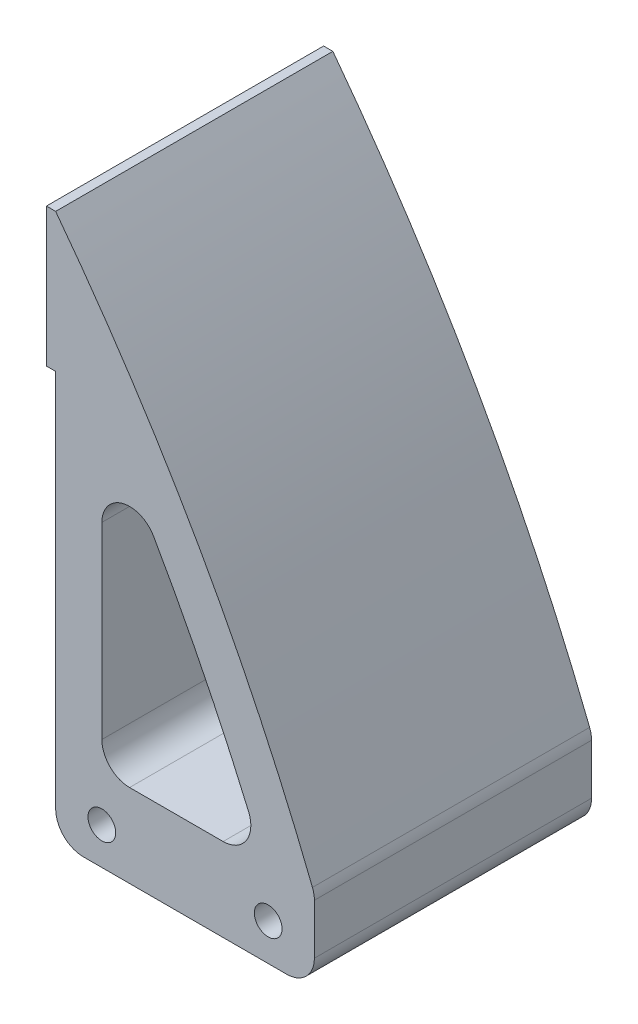
ISO-10303-21;
HEADER;
FILE_DESCRIPTION(('STEP AP214'),'2;1');
FILE_NAME('part.step','',(''),(''),'','','');
FILE_SCHEMA(('AUTOMOTIVE_DESIGN { 1 0 10303 214 1 1 1 1 }'));
ENDSEC;
DATA;
#1=APPLICATION_CONTEXT('core data for automotive mechanical design processes');
#2=APPLICATION_PROTOCOL_DEFINITION('international standard','automotive_design',2000,#1);
#3=PRODUCT_CONTEXT('',#1,'mechanical');
#4=PRODUCT('Part','Part','',(#3));
#5=PRODUCT_RELATED_PRODUCT_CATEGORY('part','',(#4));
#6=PRODUCT_DEFINITION_FORMATION('','',#4);
#7=PRODUCT_DEFINITION_CONTEXT('part definition',#1,'design');
#8=PRODUCT_DEFINITION('design','',#6,#7);
#9=PRODUCT_DEFINITION_SHAPE('','',#8);
#10=(LENGTH_UNIT() NAMED_UNIT(*) SI_UNIT(.MILLI.,.METRE.));
#11=(NAMED_UNIT(*) PLANE_ANGLE_UNIT() SI_UNIT($,.RADIAN.));
#12=(NAMED_UNIT(*) SI_UNIT($,.STERADIAN.) SOLID_ANGLE_UNIT());
#13=UNCERTAINTY_MEASURE_WITH_UNIT(LENGTH_MEASURE(1.E-05),#10,'distance_accuracy_value','');
#14=(GEOMETRIC_REPRESENTATION_CONTEXT(3) GLOBAL_UNCERTAINTY_ASSIGNED_CONTEXT((#13)) GLOBAL_UNIT_ASSIGNED_CONTEXT((#10,
#11,#12)) REPRESENTATION_CONTEXT('',''));
#15=CARTESIAN_POINT('',(0.,0.,0.));
#16=DIRECTION('',(0.,0.,1.));
#17=DIRECTION('',(1.,0.,0.));
#18=AXIS2_PLACEMENT_3D('',#15,#16,#17);
#19=CARTESIAN_POINT('',(0.,0.,30.));
#20=DIRECTION('',(0.,0.,1.));
#21=DIRECTION('',(1.,0.,0.));
#22=AXIS2_PLACEMENT_3D('',#19,#20,#21);
#23=PLANE('',#22);
#24=DIRECTION('',(1.,0.,0.));
#25=VECTOR('',#24,1.);
#26=CARTESIAN_POINT('',(0.,6.,30.));
#27=LINE('',#26,#25);
#28=CARTESIAN_POINT('',(-6.,6.,30.));
#29=VERTEX_POINT('',#28);
#30=CARTESIAN_POINT('',(4.12224643848649,6.,30.));
#31=VERTEX_POINT('',#30);
#32=EDGE_CURVE('E209',#29,#31,#27,.T.);
#33=ORIENTED_EDGE('',*,*,#32,.F.);
#34=CARTESIAN_POINT('',(-6.,9.,30.));
#35=DIRECTION('',(0.,0.,1.));
#36=DIRECTION('',(1.,0.,0.));
#37=AXIS2_PLACEMENT_3D('',#34,#35,#36);
#38=CIRCLE('',#37,3.);
#39=CARTESIAN_POINT('',(-9.,9.,30.));
#40=VERTEX_POINT('',#39);
#41=EDGE_CURVE('E305',#29,#40,#38,.F.);
#42=ORIENTED_EDGE('',*,*,#41,.T.);
#43=DIRECTION('',(0.,1.,0.));
#44=VECTOR('',#43,1.);
#45=CARTESIAN_POINT('',(-9.,0.,30.));
#46=LINE('',#45,#44);
#47=CARTESIAN_POINT('',(-9.00000000000001,29.3493274595195,30.));
#48=VERTEX_POINT('',#47);
#49=EDGE_CURVE('E201',#40,#48,#46,.T.);
#50=ORIENTED_EDGE('',*,*,#49,.T.);
#51=CARTESIAN_POINT('',(-6.,29.3493274595195,30.));
#52=DIRECTION('',(0.,0.,1.));
#53=DIRECTION('',(1.,0.,0.));
#54=AXIS2_PLACEMENT_3D('',#51,#52,#53);
#55=CIRCLE('',#54,3.);
#56=CARTESIAN_POINT('',(-3.39337560676392,30.8344231711107,30.));
#57=VERTEX_POINT('',#56);
#58=EDGE_CURVE('E299',#48,#57,#55,.F.);
#59=ORIENTED_EDGE('',*,*,#58,.T.);
#60=CARTESIAN_POINT('',(-181.512709144563,-70.6471171209553,30.));
#61=DIRECTION('',(0.,0.,1.));
#62=DIRECTION('',(1.,0.,0.));
#63=AXIS2_PLACEMENT_3D('',#60,#61,#62);
#64=CIRCLE('',#63,205.);
#65=CARTESIAN_POINT('',(6.87920122437335,10.1828779770439,30.));
#66=VERTEX_POINT('',#65);
#67=EDGE_CURVE('E205',#57,#66,#64,.F.);
#68=ORIENTED_EDGE('',*,*,#67,.T.);
#69=CARTESIAN_POINT('',(4.12224643848649,9.00000000000001,30.));
#70=DIRECTION('',(0.,0.,1.));
#71=DIRECTION('',(1.,0.,0.));
#72=AXIS2_PLACEMENT_3D('',#69,#70,#71);
#73=CIRCLE('',#72,3.);
#74=EDGE_CURVE('E293',#66,#31,#73,.F.);
#75=ORIENTED_EDGE('',*,*,#74,.T.);
#76=EDGE_LOOP('',(#33,#42,#50,#59,#68,#75));
#77=FACE_BOUND('',#76,.T.);
#78=CARTESIAN_POINT('',(-9.00000000000001,1.,30.));
#79=DIRECTION('',(0.,0.,1.));
#80=DIRECTION('',(1.,0.,0.));
#81=AXIS2_PLACEMENT_3D('',#78,#79,#80);
#82=CIRCLE('',#81,1.5);
#83=CARTESIAN_POINT('',(-7.50000000000001,1.,30.));
#84=VERTEX_POINT('',#83);
#85=EDGE_CURVE('E213',#84,#84,#82,.T.);
#86=ORIENTED_EDGE('',*,*,#85,.F.);
#87=EDGE_LOOP('',(#86));
#88=FACE_BOUND('',#87,.T.);
#89=CARTESIAN_POINT('',(8.99999999999999,1.,30.));
#90=DIRECTION('',(0.,0.,1.));
#91=DIRECTION('',(1.,0.,0.));
#92=AXIS2_PLACEMENT_3D('',#89,#90,#91);
#93=CIRCLE('',#92,1.5);
#94=CARTESIAN_POINT('',(10.5,1.,30.));
#95=VERTEX_POINT('',#94);
#96=EDGE_CURVE('E217',#95,#95,#93,.F.);
#97=ORIENTED_EDGE('',*,*,#96,.T.);
#98=EDGE_LOOP('',(#97));
#99=FACE_BOUND('',#98,.T.);
#100=DIRECTION('',(1.,0.,0.));
#101=VECTOR('',#100,1.);
#102=CARTESIAN_POINT('',(0.,-3.,30.));
#103=LINE('',#102,#101);
#104=CARTESIAN_POINT('',(-11.,-3.,30.));
#105=VERTEX_POINT('',#104);
#106=CARTESIAN_POINT('',(11.,-3.,30.));
#107=VERTEX_POINT('',#106);
#108=EDGE_CURVE('E360',#105,#107,#103,.T.);
#109=ORIENTED_EDGE('',*,*,#108,.T.);
#110=CARTESIAN_POINT('',(11.,0.,30.));
#111=DIRECTION('',(0.,0.,1.));
#112=DIRECTION('',(1.,0.,0.));
#113=AXIS2_PLACEMENT_3D('',#110,#111,#112);
#114=CIRCLE('',#113,3.);
#115=CARTESIAN_POINT('',(14.,0.,30.));
#116=VERTEX_POINT('',#115);
#117=EDGE_CURVE('E334',#107,#116,#114,.T.);
#118=ORIENTED_EDGE('',*,*,#117,.T.);
#119=DIRECTION('',(0.,-1.,0.));
#120=VECTOR('',#119,1.);
#121=CARTESIAN_POINT('',(14.,0.,30.));
#122=LINE('',#121,#120);
#123=CARTESIAN_POINT('',(14.,5.43084826864239,30.));
#124=VERTEX_POINT('',#123);
#125=EDGE_CURVE('E184',#124,#116,#122,.T.);
#126=ORIENTED_EDGE('',*,*,#125,.F.);
#127=CARTESIAN_POINT('',(11.,5.43084826864239,30.));
#128=DIRECTION('',(0.,0.,1.));
#129=DIRECTION('',(1.,0.,0.));
#130=AXIS2_PLACEMENT_3D('',#127,#128,#129);
#131=CIRCLE('',#130,3.);
#132=CARTESIAN_POINT('',(13.7900392629647,6.53342747718728,30.));
#133=VERTEX_POINT('',#132);
#134=EDGE_CURVE('E61',#124,#133,#131,.T.);
#135=ORIENTED_EDGE('',*,*,#134,.T.);
#136=CARTESIAN_POINT('',(-181.512709144563,-70.6471171209553,30.));
#137=DIRECTION('',(0.,0.,1.));
#138=DIRECTION('',(1.,0.,0.));
#139=AXIS2_PLACEMENT_3D('',#136,#137,#138);
#140=CIRCLE('',#139,210.);
#141=CARTESIAN_POINT('',(-14.,56.,30.));
#142=VERTEX_POINT('',#141);
#143=EDGE_CURVE('E164',#142,#133,#140,.F.);
#144=ORIENTED_EDGE('',*,*,#143,.F.);
#145=DIRECTION('',(-1.,0.,0.));
#146=VECTOR('',#145,1.);
#147=CARTESIAN_POINT('',(0.,56.,30.));
#148=LINE('',#147,#146);
#149=CARTESIAN_POINT('',(-15.,56.,30.));
#150=VERTEX_POINT('',#149);
#151=EDGE_CURVE('E175',#142,#150,#148,.T.);
#152=ORIENTED_EDGE('',*,*,#151,.T.);
#153=DIRECTION('',(0.,-1.,0.));
#154=VECTOR('',#153,1.);
#155=CARTESIAN_POINT('',(-15.,0.,30.));
#156=LINE('',#155,#154);
#157=CARTESIAN_POINT('',(-15.,41.,30.));
#158=VERTEX_POINT('',#157);
#159=EDGE_CURVE('E180',#150,#158,#156,.T.);
#160=ORIENTED_EDGE('',*,*,#159,.T.);
#161=DIRECTION('',(-1.,0.,0.));
#162=VECTOR('',#161,1.);
#163=CARTESIAN_POINT('',(0.,41.,30.));
#164=LINE('',#163,#162);
#165=CARTESIAN_POINT('',(-14.,41.,30.));
#166=VERTEX_POINT('',#165);
#167=EDGE_CURVE('E194',#166,#158,#164,.T.);
#168=ORIENTED_EDGE('',*,*,#167,.F.);
#169=DIRECTION('',(0.,1.,0.));
#170=VECTOR('',#169,1.);
#171=CARTESIAN_POINT('',(-14.,0.,30.));
#172=LINE('',#171,#170);
#173=CARTESIAN_POINT('',(-14.,0.,30.));
#174=VERTEX_POINT('',#173);
#175=EDGE_CURVE('E198',#174,#166,#172,.T.);
#176=ORIENTED_EDGE('',*,*,#175,.F.);
#177=CARTESIAN_POINT('',(-11.,0.,30.));
#178=DIRECTION('',(0.,0.,1.));
#179=DIRECTION('',(1.,0.,0.));
#180=AXIS2_PLACEMENT_3D('',#177,#178,#179);
#181=CIRCLE('',#180,3.);
#182=EDGE_CURVE('E69',#174,#105,#181,.T.);
#183=ORIENTED_EDGE('',*,*,#182,.T.);
#184=EDGE_LOOP('',(#109,#118,#126,#135,#144,#152,#160,#168,#176,#183));
#185=FACE_BOUND('',#184,.T.);
#186=ADVANCED_FACE('F45',(#77,#88,#99,#185),#23,.T.);
#187=CARTESIAN_POINT('',(0.,0.,0.));
#188=DIRECTION('',(0.,0.,1.));
#189=DIRECTION('',(1.,0.,0.));
#190=AXIS2_PLACEMENT_3D('',#187,#188,#189);
#191=PLANE('',#190);
#192=CARTESIAN_POINT('',(8.99999999999999,1.,0.));
#193=DIRECTION('',(0.,0.,1.));
#194=DIRECTION('',(1.,0.,0.));
#195=AXIS2_PLACEMENT_3D('',#192,#193,#194);
#196=CIRCLE('',#195,1.5);
#197=CARTESIAN_POINT('',(10.5,1.,0.));
#198=VERTEX_POINT('',#197);
#199=EDGE_CURVE('E188',#198,#198,#196,.F.);
#200=ORIENTED_EDGE('',*,*,#199,.F.);
#201=EDGE_LOOP('',(#200));
#202=FACE_BOUND('',#201,.T.);
#203=CARTESIAN_POINT('',(-9.00000000000001,1.,0.));
#204=DIRECTION('',(0.,0.,1.));
#205=DIRECTION('',(1.,0.,0.));
#206=AXIS2_PLACEMENT_3D('',#203,#204,#205);
#207=CIRCLE('',#206,1.5);
#208=CARTESIAN_POINT('',(-7.50000000000001,1.,0.));
#209=VERTEX_POINT('',#208);
#210=EDGE_CURVE('E255',#209,#209,#207,.T.);
#211=ORIENTED_EDGE('',*,*,#210,.T.);
#212=EDGE_LOOP('',(#211));
#213=FACE_BOUND('',#212,.T.);
#214=DIRECTION('',(0.,1.,0.));
#215=VECTOR('',#214,1.);
#216=CARTESIAN_POINT('',(-9.,0.,0.));
#217=LINE('',#216,#215);
#218=CARTESIAN_POINT('',(-9.,9.,0.));
#219=VERTEX_POINT('',#218);
#220=CARTESIAN_POINT('',(-9.00000000000001,29.3493274595195,0.));
#221=VERTEX_POINT('',#220);
#222=EDGE_CURVE('E243',#219,#221,#217,.T.);
#223=ORIENTED_EDGE('',*,*,#222,.F.);
#224=CARTESIAN_POINT('',(-6.,9.,0.));
#225=DIRECTION('',(0.,0.,1.));
#226=DIRECTION('',(1.,0.,0.));
#227=AXIS2_PLACEMENT_3D('',#224,#225,#226);
#228=CIRCLE('',#227,3.);
#229=CARTESIAN_POINT('',(-6.,6.,0.));
#230=VERTEX_POINT('',#229);
#231=EDGE_CURVE('E302',#219,#230,#228,.T.);
#232=ORIENTED_EDGE('',*,*,#231,.T.);
#233=DIRECTION('',(1.,0.,0.));
#234=VECTOR('',#233,1.);
#235=CARTESIAN_POINT('',(0.,6.,0.));
#236=LINE('',#235,#234);
#237=CARTESIAN_POINT('',(4.12224643848649,6.,0.));
#238=VERTEX_POINT('',#237);
#239=EDGE_CURVE('E251',#230,#238,#236,.T.);
#240=ORIENTED_EDGE('',*,*,#239,.T.);
#241=CARTESIAN_POINT('',(4.12224643848649,9.00000000000001,0.));
#242=DIRECTION('',(0.,0.,1.));
#243=DIRECTION('',(1.,0.,0.));
#244=AXIS2_PLACEMENT_3D('',#241,#242,#243);
#245=CIRCLE('',#244,3.);
#246=CARTESIAN_POINT('',(6.87920122437335,10.1828779770439,0.));
#247=VERTEX_POINT('',#246);
#248=EDGE_CURVE('E290',#238,#247,#245,.T.);
#249=ORIENTED_EDGE('',*,*,#248,.T.);
#250=CARTESIAN_POINT('',(-181.512709144563,-70.6471171209553,0.));
#251=DIRECTION('',(0.,0.,1.));
#252=DIRECTION('',(1.,0.,0.));
#253=AXIS2_PLACEMENT_3D('',#250,#251,#252);
#254=CIRCLE('',#253,205.);
#255=CARTESIAN_POINT('',(-3.39337560676392,30.8344231711107,0.));
#256=VERTEX_POINT('',#255);
#257=EDGE_CURVE('E247',#256,#247,#254,.F.);
#258=ORIENTED_EDGE('',*,*,#257,.F.);
#259=CARTESIAN_POINT('',(-6.,29.3493274595195,0.));
#260=DIRECTION('',(0.,0.,1.));
#261=DIRECTION('',(1.,0.,0.));
#262=AXIS2_PLACEMENT_3D('',#259,#260,#261);
#263=CIRCLE('',#262,3.);
#264=EDGE_CURVE('E296',#256,#221,#263,.T.);
#265=ORIENTED_EDGE('',*,*,#264,.T.);
#266=EDGE_LOOP('',(#223,#232,#240,#249,#258,#265));
#267=FACE_BOUND('',#266,.T.);
#268=DIRECTION('',(0.,-1.,0.));
#269=VECTOR('',#268,1.);
#270=CARTESIAN_POINT('',(14.,0.,0.));
#271=LINE('',#270,#269);
#272=CARTESIAN_POINT('',(14.,5.43084826864239,0.));
#273=VERTEX_POINT('',#272);
#274=CARTESIAN_POINT('',(14.,0.,0.));
#275=VERTEX_POINT('',#274);
#276=EDGE_CURVE('E222',#273,#275,#271,.T.);
#277=ORIENTED_EDGE('',*,*,#276,.T.);
#278=CARTESIAN_POINT('',(11.,0.,0.));
#279=DIRECTION('',(0.,0.,1.));
#280=DIRECTION('',(1.,0.,0.));
#281=AXIS2_PLACEMENT_3D('',#278,#279,#280);
#282=CIRCLE('',#281,3.);
#283=CARTESIAN_POINT('',(11.,-3.,0.));
#284=VERTEX_POINT('',#283);
#285=EDGE_CURVE('E321',#275,#284,#282,.F.);
#286=ORIENTED_EDGE('',*,*,#285,.T.);
#287=DIRECTION('',(1.,0.,0.));
#288=VECTOR('',#287,1.);
#289=CARTESIAN_POINT('',(0.,-3.,0.));
#290=LINE('',#289,#288);
#291=CARTESIAN_POINT('',(-11.,-3.,0.));
#292=VERTEX_POINT('',#291);
#293=EDGE_CURVE('E226',#292,#284,#290,.T.);
#294=ORIENTED_EDGE('',*,*,#293,.F.);
#295=CARTESIAN_POINT('',(-11.,0.,0.));
#296=DIRECTION('',(0.,0.,1.));
#297=DIRECTION('',(1.,0.,0.));
#298=AXIS2_PLACEMENT_3D('',#295,#296,#297);
#299=CIRCLE('',#298,3.);
#300=CARTESIAN_POINT('',(-14.,0.,0.));
#301=VERTEX_POINT('',#300);
#302=EDGE_CURVE('E315',#292,#301,#299,.F.);
#303=ORIENTED_EDGE('',*,*,#302,.T.);
#304=DIRECTION('',(0.,1.,0.));
#305=VECTOR('',#304,1.);
#306=CARTESIAN_POINT('',(-14.,0.,0.));
#307=LINE('',#306,#305);
#308=CARTESIAN_POINT('',(-14.,41.,0.));
#309=VERTEX_POINT('',#308);
#310=EDGE_CURVE('E240',#301,#309,#307,.T.);
#311=ORIENTED_EDGE('',*,*,#310,.T.);
#312=DIRECTION('',(-1.,0.,0.));
#313=VECTOR('',#312,1.);
#314=CARTESIAN_POINT('',(0.,41.,0.));
#315=LINE('',#314,#313);
#316=CARTESIAN_POINT('',(-15.,41.,0.));
#317=VERTEX_POINT('',#316);
#318=EDGE_CURVE('E236',#309,#317,#315,.T.);
#319=ORIENTED_EDGE('',*,*,#318,.T.);
#320=DIRECTION('',(0.,-1.,0.));
#321=VECTOR('',#320,1.);
#322=CARTESIAN_POINT('',(-15.,0.,0.));
#323=LINE('',#322,#321);
#324=CARTESIAN_POINT('',(-15.,56.,0.));
#325=VERTEX_POINT('',#324);
#326=EDGE_CURVE('E232',#325,#317,#323,.T.);
#327=ORIENTED_EDGE('',*,*,#326,.F.);
#328=DIRECTION('',(-1.,0.,0.));
#329=VECTOR('',#328,1.);
#330=CARTESIAN_POINT('',(0.,56.,0.));
#331=LINE('',#330,#329);
#332=CARTESIAN_POINT('',(-14.,56.,0.));
#333=VERTEX_POINT('',#332);
#334=EDGE_CURVE('E229',#333,#325,#331,.T.);
#335=ORIENTED_EDGE('',*,*,#334,.F.);
#336=CARTESIAN_POINT('',(-181.512709144563,-70.6471171209553,0.));
#337=DIRECTION('',(0.,0.,1.));
#338=DIRECTION('',(1.,0.,0.));
#339=AXIS2_PLACEMENT_3D('',#336,#337,#338);
#340=CIRCLE('',#339,210.);
#341=CARTESIAN_POINT('',(13.7900392629647,6.53342747718728,0.));
#342=VERTEX_POINT('',#341);
#343=EDGE_CURVE('E167',#333,#342,#340,.F.);
#344=ORIENTED_EDGE('',*,*,#343,.T.);
#345=CARTESIAN_POINT('',(11.,5.43084826864239,0.));
#346=DIRECTION('',(0.,0.,1.));
#347=DIRECTION('',(1.,0.,0.));
#348=AXIS2_PLACEMENT_3D('',#345,#346,#347);
#349=CIRCLE('',#348,3.);
#350=EDGE_CURVE('E318',#342,#273,#349,.F.);
#351=ORIENTED_EDGE('',*,*,#350,.T.);
#352=EDGE_LOOP('',(#277,#286,#294,#303,#311,#319,#327,#335,#344,#351));
#353=FACE_BOUND('',#352,.T.);
#354=ADVANCED_FACE('F339',(#202,#213,#267,#353),#191,.F.);
#355=CARTESIAN_POINT('',(-9.,0.,30.));
#356=DIRECTION('',(-1.,0.,0.));
#357=DIRECTION('',(0.,-1.,0.));
#358=AXIS2_PLACEMENT_3D('',#355,#356,#357);
#359=PLANE('',#358);
#360=ORIENTED_EDGE('',*,*,#222,.T.);
#361=DIRECTION('',(0.,0.,1.));
#362=VECTOR('',#361,1.);
#363=CARTESIAN_POINT('',(-9.00000000000001,29.3493274595195,30.));
#364=LINE('',#363,#362);
#365=EDGE_CURVE('E287',#221,#48,#364,.T.);
#366=ORIENTED_EDGE('',*,*,#365,.T.);
#367=ORIENTED_EDGE('',*,*,#49,.F.);
#368=DIRECTION('',(0.,0.,-1.));
#369=VECTOR('',#368,1.);
#370=CARTESIAN_POINT('',(-9.,9.,30.));
#371=LINE('',#370,#369);
#372=EDGE_CURVE('E283',#40,#219,#371,.T.);
#373=ORIENTED_EDGE('',*,*,#372,.T.);
#374=EDGE_LOOP('',(#360,#366,#367,#373));
#375=FACE_BOUND('',#374,.T.);
#376=ADVANCED_FACE('F385',(#375),#359,.F.);
#377=CARTESIAN_POINT('',(-181.512709144563,-70.6471171209553,30.));
#378=DIRECTION('',(0.,0.,-1.));
#379=DIRECTION('',(-1.,0.,0.));
#380=AXIS2_PLACEMENT_3D('',#377,#378,#379);
#381=CYLINDRICAL_SURFACE('',#380,205.);
#382=ORIENTED_EDGE('',*,*,#257,.T.);
#383=DIRECTION('',(0.,0.,-1.));
#384=VECTOR('',#383,1.);
#385=CARTESIAN_POINT('',(6.87920122437338,10.1828779770439,30.));
#386=LINE('',#385,#384);
#387=EDGE_CURVE('E280',#247,#66,#386,.F.);
#388=ORIENTED_EDGE('',*,*,#387,.T.);
#389=ORIENTED_EDGE('',*,*,#67,.F.);
#390=DIRECTION('',(0.,0.,-1.));
#391=VECTOR('',#390,1.);
#392=CARTESIAN_POINT('',(-3.39337560676387,30.8344231711107,30.));
#393=LINE('',#392,#391);
#394=EDGE_CURVE('E276',#57,#256,#393,.T.);
#395=ORIENTED_EDGE('',*,*,#394,.T.);
#396=EDGE_LOOP('',(#382,#388,#389,#395));
#397=FACE_BOUND('',#396,.T.);
#398=ADVANCED_FACE('F405',(#397),#381,.F.);
#399=CARTESIAN_POINT('',(14.,0.,30.));
#400=DIRECTION('',(1.,0.,0.));
#401=DIRECTION('',(0.,0.,-1.));
#402=AXIS2_PLACEMENT_3D('',#399,#400,#401);
#403=PLANE('',#402);
#404=ORIENTED_EDGE('',*,*,#125,.T.);
#405=DIRECTION('',(0.,0.,-1.));
#406=VECTOR('',#405,1.);
#407=CARTESIAN_POINT('',(14.,0.,30.));
#408=LINE('',#407,#406);
#409=EDGE_CURVE('E311',#116,#275,#408,.T.);
#410=ORIENTED_EDGE('',*,*,#409,.T.);
#411=ORIENTED_EDGE('',*,*,#276,.F.);
#412=DIRECTION('',(0.,0.,-1.));
#413=VECTOR('',#412,1.);
#414=CARTESIAN_POINT('',(14.,5.43084826864239,30.));
#415=LINE('',#414,#413);
#416=EDGE_CURVE('E308',#273,#124,#415,.F.);
#417=ORIENTED_EDGE('',*,*,#416,.T.);
#418=EDGE_LOOP('',(#404,#410,#411,#417));
#419=FACE_BOUND('',#418,.T.);
#420=ADVANCED_FACE('F369',(#419),#403,.T.);
#421=CARTESIAN_POINT('',(-181.512709144563,-70.6471171209553,30.));
#422=DIRECTION('',(0.,0.,-1.));
#423=DIRECTION('',(-1.,0.,0.));
#424=AXIS2_PLACEMENT_3D('',#421,#422,#423);
#425=CYLINDRICAL_SURFACE('',#424,210.);
#426=ORIENTED_EDGE('',*,*,#143,.T.);
#427=DIRECTION('',(0.,0.,-1.));
#428=VECTOR('',#427,1.);
#429=CARTESIAN_POINT('',(13.7900392629647,6.53342747718728,30.));
#430=LINE('',#429,#428);
#431=EDGE_CURVE('E54',#133,#342,#430,.T.);
#432=ORIENTED_EDGE('',*,*,#431,.T.);
#433=ORIENTED_EDGE('',*,*,#343,.F.);
#434=DIRECTION('',(0.,0.,-1.));
#435=VECTOR('',#434,1.);
#436=CARTESIAN_POINT('',(-14.,56.,30.));
#437=LINE('',#436,#435);
#438=EDGE_CURVE('E160',#142,#333,#437,.T.);
#439=ORIENTED_EDGE('',*,*,#438,.F.);
#440=EDGE_LOOP('',(#426,#432,#433,#439));
#441=FACE_BOUND('',#440,.T.);
#442=ADVANCED_FACE('F162',(#441),#425,.T.);
#443=CARTESIAN_POINT('',(0.,56.,30.));
#444=DIRECTION('',(0.,-1.,0.));
#445=DIRECTION('',(0.,0.,-1.));
#446=AXIS2_PLACEMENT_3D('',#443,#444,#445);
#447=PLANE('',#446);
#448=ORIENTED_EDGE('',*,*,#334,.T.);
#449=DIRECTION('',(0.,0.,-1.));
#450=VECTOR('',#449,1.);
#451=CARTESIAN_POINT('',(-15.,56.,30.));
#452=LINE('',#451,#450);
#453=EDGE_CURVE('E172',#150,#325,#452,.T.);
#454=ORIENTED_EDGE('',*,*,#453,.F.);
#455=ORIENTED_EDGE('',*,*,#151,.F.);
#456=ORIENTED_EDGE('',*,*,#438,.T.);
#457=EDGE_LOOP('',(#448,#454,#455,#456));
#458=FACE_BOUND('',#457,.T.);
#459=ADVANCED_FACE('F176',(#458),#447,.F.);
#460=CARTESIAN_POINT('',(-15.,0.,30.));
#461=DIRECTION('',(1.,0.,0.));
#462=DIRECTION('',(0.,0.,-1.));
#463=AXIS2_PLACEMENT_3D('',#460,#461,#462);
#464=PLANE('',#463);
#465=ORIENTED_EDGE('',*,*,#326,.T.);
#466=DIRECTION('',(0.,0.,-1.));
#467=VECTOR('',#466,1.);
#468=CARTESIAN_POINT('',(-15.,41.,30.));
#469=LINE('',#468,#467);
#470=EDGE_CURVE('E265',#158,#317,#469,.T.);
#471=ORIENTED_EDGE('',*,*,#470,.F.);
#472=ORIENTED_EDGE('',*,*,#159,.F.);
#473=ORIENTED_EDGE('',*,*,#453,.T.);
#474=EDGE_LOOP('',(#465,#471,#472,#473));
#475=FACE_BOUND('',#474,.T.);
#476=ADVANCED_FACE('F343',(#475),#464,.F.);
#477=CARTESIAN_POINT('',(0.,41.,30.));
#478=DIRECTION('',(0.,-1.,0.));
#479=DIRECTION('',(0.,0.,-1.));
#480=AXIS2_PLACEMENT_3D('',#477,#478,#479);
#481=PLANE('',#480);
#482=ORIENTED_EDGE('',*,*,#318,.F.);
#483=DIRECTION('',(0.,0.,-1.));
#484=VECTOR('',#483,1.);
#485=CARTESIAN_POINT('',(-14.,41.,30.));
#486=LINE('',#485,#484);
#487=EDGE_CURVE('E221',#166,#309,#486,.T.);
#488=ORIENTED_EDGE('',*,*,#487,.F.);
#489=ORIENTED_EDGE('',*,*,#167,.T.);
#490=ORIENTED_EDGE('',*,*,#470,.T.);
#491=EDGE_LOOP('',(#482,#488,#489,#490));
#492=FACE_BOUND('',#491,.T.);
#493=ADVANCED_FACE('F350',(#492),#481,.T.);
#494=CARTESIAN_POINT('',(-14.,0.,30.));
#495=DIRECTION('',(-1.,0.,0.));
#496=DIRECTION('',(0.,-1.,0.));
#497=AXIS2_PLACEMENT_3D('',#494,#495,#496);
#498=PLANE('',#497);
#499=ORIENTED_EDGE('',*,*,#310,.F.);
#500=DIRECTION('',(0.,0.,1.));
#501=VECTOR('',#500,1.);
#502=CARTESIAN_POINT('',(-14.,0.,30.));
#503=LINE('',#502,#501);
#504=EDGE_CURVE('E11',#301,#174,#503,.T.);
#505=ORIENTED_EDGE('',*,*,#504,.T.);
#506=ORIENTED_EDGE('',*,*,#175,.T.);
#507=ORIENTED_EDGE('',*,*,#487,.T.);
#508=EDGE_LOOP('',(#499,#505,#506,#507));
#509=FACE_BOUND('',#508,.T.);
#510=ADVANCED_FACE('F353',(#509),#498,.T.);
#511=CARTESIAN_POINT('',(-9.00000000000001,1.,30.));
#512=DIRECTION('',(0.,0.,-1.));
#513=DIRECTION('',(-1.,0.,0.));
#514=AXIS2_PLACEMENT_3D('',#511,#512,#513);
#515=CYLINDRICAL_SURFACE('',#514,1.5);
#516=ORIENTED_EDGE('',*,*,#85,.T.);
#517=EDGE_LOOP('',(#516));
#518=FACE_BOUND('',#517,.T.);
#519=ORIENTED_EDGE('',*,*,#210,.F.);
#520=EDGE_LOOP('',(#519));
#521=FACE_BOUND('',#520,.T.);
#522=ADVANCED_FACE('F398',(#518,#521),#515,.F.);
#523=CARTESIAN_POINT('',(0.,6.,30.));
#524=DIRECTION('',(0.,1.,0.));
#525=DIRECTION('',(0.,0.,1.));
#526=AXIS2_PLACEMENT_3D('',#523,#524,#525);
#527=PLANE('',#526);
#528=ORIENTED_EDGE('',*,*,#32,.T.);
#529=DIRECTION('',(0.,0.,-1.));
#530=VECTOR('',#529,1.);
#531=CARTESIAN_POINT('',(4.12224643848649,6.,30.));
#532=LINE('',#531,#530);
#533=EDGE_CURVE('E272',#31,#238,#532,.T.);
#534=ORIENTED_EDGE('',*,*,#533,.T.);
#535=ORIENTED_EDGE('',*,*,#239,.F.);
#536=DIRECTION('',(0.,0.,-1.));
#537=VECTOR('',#536,1.);
#538=CARTESIAN_POINT('',(-6.,6.,30.));
#539=LINE('',#538,#537);
#540=EDGE_CURVE('E171',#230,#29,#539,.F.);
#541=ORIENTED_EDGE('',*,*,#540,.T.);
#542=EDGE_LOOP('',(#528,#534,#535,#541));
#543=FACE_BOUND('',#542,.T.);
#544=ADVANCED_FACE('F396',(#543),#527,.T.);
#545=CARTESIAN_POINT('',(8.99999999999999,1.,30.));
#546=DIRECTION('',(0.,0.,-1.));
#547=DIRECTION('',(-1.,0.,0.));
#548=AXIS2_PLACEMENT_3D('',#545,#546,#547);
#549=CYLINDRICAL_SURFACE('',#548,1.5);
#550=ORIENTED_EDGE('',*,*,#96,.F.);
#551=EDGE_LOOP('',(#550));
#552=FACE_BOUND('',#551,.T.);
#553=ORIENTED_EDGE('',*,*,#199,.T.);
#554=EDGE_LOOP('',(#553));
#555=FACE_BOUND('',#554,.T.);
#556=ADVANCED_FACE('F392',(#552,#555),#549,.F.);
#557=CARTESIAN_POINT('',(4.12224643848649,9.00000000000001,30.));
#558=DIRECTION('',(0.,0.,-1.));
#559=DIRECTION('',(-1.,0.,0.));
#560=AXIS2_PLACEMENT_3D('',#557,#558,#559);
#561=CYLINDRICAL_SURFACE('',#560,3.);
#562=ORIENTED_EDGE('',*,*,#74,.F.);
#563=ORIENTED_EDGE('',*,*,#387,.F.);
#564=ORIENTED_EDGE('',*,*,#248,.F.);
#565=ORIENTED_EDGE('',*,*,#533,.F.);
#566=EDGE_LOOP('',(#562,#563,#564,#565));
#567=FACE_BOUND('',#566,.T.);
#568=ADVANCED_FACE('F395',(#567),#561,.F.);
#569=CARTESIAN_POINT('',(-6.,29.3493274595195,30.));
#570=DIRECTION('',(0.,0.,-1.));
#571=DIRECTION('',(-1.,0.,0.));
#572=AXIS2_PLACEMENT_3D('',#569,#570,#571);
#573=CYLINDRICAL_SURFACE('',#572,3.);
#574=ORIENTED_EDGE('',*,*,#58,.F.);
#575=ORIENTED_EDGE('',*,*,#365,.F.);
#576=ORIENTED_EDGE('',*,*,#264,.F.);
#577=ORIENTED_EDGE('',*,*,#394,.F.);
#578=EDGE_LOOP('',(#574,#575,#576,#577));
#579=FACE_BOUND('',#578,.T.);
#580=ADVANCED_FACE('F426',(#579),#573,.F.);
#581=CARTESIAN_POINT('',(-6.,9.,30.));
#582=DIRECTION('',(0.,0.,-1.));
#583=DIRECTION('',(-1.,0.,0.));
#584=AXIS2_PLACEMENT_3D('',#581,#582,#583);
#585=CYLINDRICAL_SURFACE('',#584,3.);
#586=ORIENTED_EDGE('',*,*,#41,.F.);
#587=ORIENTED_EDGE('',*,*,#540,.F.);
#588=ORIENTED_EDGE('',*,*,#231,.F.);
#589=ORIENTED_EDGE('',*,*,#372,.F.);
#590=EDGE_LOOP('',(#586,#587,#588,#589));
#591=FACE_BOUND('',#590,.T.);
#592=ADVANCED_FACE('F430',(#591),#585,.F.);
#593=CARTESIAN_POINT('',(0.,-3.,0.));
#594=DIRECTION('',(0.,-1.,0.));
#595=DIRECTION('',(0.,0.,-1.));
#596=AXIS2_PLACEMENT_3D('',#593,#594,#595);
#597=PLANE('',#596);
#598=ORIENTED_EDGE('',*,*,#293,.T.);
#599=DIRECTION('',(0.,0.,-1.));
#600=VECTOR('',#599,1.);
#601=CARTESIAN_POINT('',(11.,-3.,0.));
#602=LINE('',#601,#600);
#603=EDGE_CURVE('E327',#284,#107,#602,.F.);
#604=ORIENTED_EDGE('',*,*,#603,.T.);
#605=ORIENTED_EDGE('',*,*,#108,.F.);
#606=DIRECTION('',(0.,0.,1.));
#607=VECTOR('',#606,1.);
#608=CARTESIAN_POINT('',(-11.,-3.,0.));
#609=LINE('',#608,#607);
#610=EDGE_CURVE('E324',#105,#292,#609,.F.);
#611=ORIENTED_EDGE('',*,*,#610,.T.);
#612=EDGE_LOOP('',(#598,#604,#605,#611));
#613=FACE_BOUND('',#612,.T.);
#614=ADVANCED_FACE('F377',(#613),#597,.T.);
#615=CARTESIAN_POINT('',(11.,0.,30.));
#616=DIRECTION('',(0.,0.,-1.));
#617=DIRECTION('',(-1.,0.,0.));
#618=AXIS2_PLACEMENT_3D('',#615,#616,#617);
#619=CYLINDRICAL_SURFACE('',#618,3.);
#620=ORIENTED_EDGE('',*,*,#117,.F.);
#621=ORIENTED_EDGE('',*,*,#603,.F.);
#622=ORIENTED_EDGE('',*,*,#285,.F.);
#623=ORIENTED_EDGE('',*,*,#409,.F.);
#624=EDGE_LOOP('',(#620,#621,#622,#623));
#625=FACE_BOUND('',#624,.T.);
#626=ADVANCED_FACE('F367',(#625),#619,.T.);
#627=CARTESIAN_POINT('',(11.,5.43084826864239,30.));
#628=DIRECTION('',(0.,0.,-1.));
#629=DIRECTION('',(-1.,0.,0.));
#630=AXIS2_PLACEMENT_3D('',#627,#628,#629);
#631=CYLINDRICAL_SURFACE('',#630,3.);
#632=ORIENTED_EDGE('',*,*,#134,.F.);
#633=ORIENTED_EDGE('',*,*,#416,.F.);
#634=ORIENTED_EDGE('',*,*,#350,.F.);
#635=ORIENTED_EDGE('',*,*,#431,.F.);
#636=EDGE_LOOP('',(#632,#633,#634,#635));
#637=FACE_BOUND('',#636,.T.);
#638=ADVANCED_FACE('F371',(#637),#631,.T.);
#639=CARTESIAN_POINT('',(-11.,0.,30.));
#640=DIRECTION('',(0.,0.,1.));
#641=DIRECTION('',(1.,0.,0.));
#642=AXIS2_PLACEMENT_3D('',#639,#640,#641);
#643=CYLINDRICAL_SURFACE('',#642,3.);
#644=ORIENTED_EDGE('',*,*,#302,.F.);
#645=ORIENTED_EDGE('',*,*,#610,.F.);
#646=ORIENTED_EDGE('',*,*,#182,.F.);
#647=ORIENTED_EDGE('',*,*,#504,.F.);
#648=EDGE_LOOP('',(#644,#645,#646,#647));
#649=FACE_BOUND('',#648,.T.);
#650=ADVANCED_FACE('F47',(#649),#643,.T.);
#651=CLOSED_SHELL('',(#186,#354,#376,#398,#420,#442,#459,#476,#493,#510,#522,#544,#556,#568,
#580,#592,#614,#626,#638,#650));
#652=MANIFOLD_SOLID_BREP('B2',#651);
#653=ADVANCED_BREP_SHAPE_REPRESENTATION('',(#18,#652),#14);
#654=SHAPE_DEFINITION_REPRESENTATION(#9,#653);
ENDSEC;
END-ISO-10303-21;
